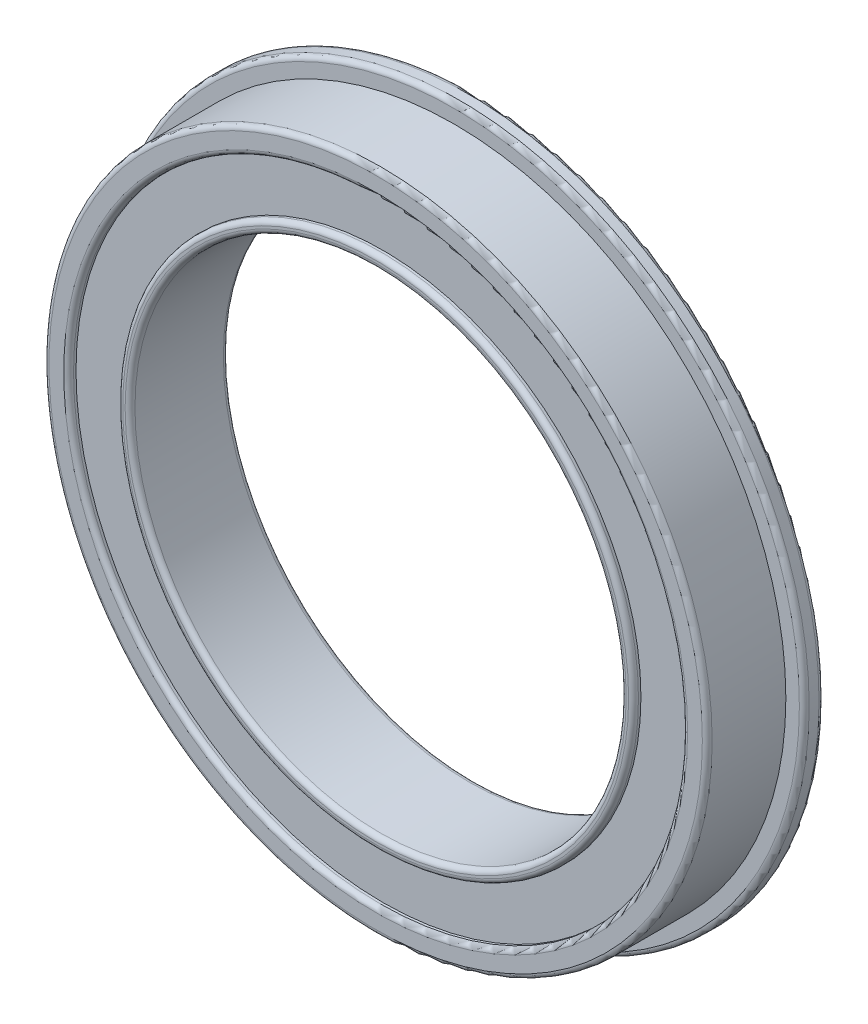
ISO-10303-21;
HEADER;
FILE_DESCRIPTION(('STEP AP214'),'2;1');
FILE_NAME('part.step','',(''),(''),'','','');
FILE_SCHEMA(('AUTOMOTIVE_DESIGN { 1 0 10303 214 1 1 1 1 }'));
ENDSEC;
DATA;
#1=APPLICATION_CONTEXT('core data for automotive mechanical design processes');
#2=APPLICATION_PROTOCOL_DEFINITION('international standard','automotive_design',2000,#1);
#3=PRODUCT_CONTEXT('',#1,'mechanical');
#4=PRODUCT('Part','Part','',(#3));
#5=PRODUCT_RELATED_PRODUCT_CATEGORY('part','',(#4));
#6=PRODUCT_DEFINITION_FORMATION('','',#4);
#7=PRODUCT_DEFINITION_CONTEXT('part definition',#1,'design');
#8=PRODUCT_DEFINITION('design','',#6,#7);
#9=PRODUCT_DEFINITION_SHAPE('','',#8);
#10=(LENGTH_UNIT() NAMED_UNIT(*) SI_UNIT(.MILLI.,.METRE.));
#11=(NAMED_UNIT(*) PLANE_ANGLE_UNIT() SI_UNIT($,.RADIAN.));
#12=(NAMED_UNIT(*) SI_UNIT($,.STERADIAN.) SOLID_ANGLE_UNIT());
#13=UNCERTAINTY_MEASURE_WITH_UNIT(LENGTH_MEASURE(1.E-05),#10,'distance_accuracy_value','');
#14=(GEOMETRIC_REPRESENTATION_CONTEXT(3) GLOBAL_UNCERTAINTY_ASSIGNED_CONTEXT((#13)) GLOBAL_UNIT_ASSIGNED_CONTEXT((#10,
#11,#12)) REPRESENTATION_CONTEXT('',''));
#15=CARTESIAN_POINT('',(0.,0.,0.));
#16=DIRECTION('',(0.,0.,1.));
#17=DIRECTION('',(1.,0.,0.));
#18=AXIS2_PLACEMENT_3D('',#15,#16,#17);
#19=CARTESIAN_POINT('',(0.,0.,0.));
#20=DIRECTION('',(0.,0.,1.));
#21=DIRECTION('',(1.,0.,0.));
#22=AXIS2_PLACEMENT_3D('',#19,#20,#21);
#23=PLANE('',#22);
#24=CARTESIAN_POINT('',(0.,0.,0.));
#25=DIRECTION('',(0.,0.,1.));
#26=DIRECTION('',(1.,0.,0.));
#27=AXIS2_PLACEMENT_3D('',#24,#25,#26);
#28=CIRCLE('',#27,10.3);
#29=CARTESIAN_POINT('',(10.3,0.,0.));
#30=VERTEX_POINT('',#29);
#31=EDGE_CURVE('E81',#30,#30,#28,.F.);
#32=ORIENTED_EDGE('',*,*,#31,.T.);
#33=EDGE_LOOP('',(#32));
#34=FACE_BOUND('',#33,.T.);
#35=CARTESIAN_POINT('',(0.,0.,0.));
#36=DIRECTION('',(0.,0.,1.));
#37=DIRECTION('',(1.,0.,0.));
#38=AXIS2_PLACEMENT_3D('',#35,#36,#37);
#39=CIRCLE('',#38,10.2);
#40=CARTESIAN_POINT('',(10.2,0.,0.));
#41=VERTEX_POINT('',#40);
#42=EDGE_CURVE('E84',#41,#41,#39,.T.);
#43=ORIENTED_EDGE('',*,*,#42,.T.);
#44=EDGE_LOOP('',(#43));
#45=FACE_BOUND('',#44,.T.);
#46=ADVANCED_FACE('F25',(#34,#45),#23,.F.);
#47=CARTESIAN_POINT('',(0.,0.,4.));
#48=DIRECTION('',(0.,0.,1.));
#49=DIRECTION('',(1.,0.,0.));
#50=AXIS2_PLACEMENT_3D('',#47,#48,#49);
#51=PLANE('',#50);
#52=CARTESIAN_POINT('',(0.,0.,4.));
#53=DIRECTION('',(0.,0.,1.));
#54=DIRECTION('',(1.,0.,0.));
#55=AXIS2_PLACEMENT_3D('',#52,#53,#54);
#56=CIRCLE('',#55,10.3);
#57=CARTESIAN_POINT('',(10.3,0.,4.));
#58=VERTEX_POINT('',#57);
#59=EDGE_CURVE('E54',#58,#58,#56,.T.);
#60=ORIENTED_EDGE('',*,*,#59,.T.);
#61=EDGE_LOOP('',(#60));
#62=FACE_BOUND('',#61,.T.);
#63=CARTESIAN_POINT('',(0.,0.,4.));
#64=DIRECTION('',(0.,0.,1.));
#65=DIRECTION('',(1.,0.,0.));
#66=AXIS2_PLACEMENT_3D('',#63,#64,#65);
#67=CIRCLE('',#66,10.2);
#68=CARTESIAN_POINT('',(10.2,0.,4.));
#69=VERTEX_POINT('',#68);
#70=EDGE_CURVE('E57',#69,#69,#67,.F.);
#71=ORIENTED_EDGE('',*,*,#70,.T.);
#72=EDGE_LOOP('',(#71));
#73=FACE_BOUND('',#72,.T.);
#74=ADVANCED_FACE('F124',(#62,#73),#51,.T.);
#75=CARTESIAN_POINT('',(0.,0.,0.8));
#76=DIRECTION('',(0.,0.,1.));
#77=DIRECTION('',(1.,0.,0.));
#78=AXIS2_PLACEMENT_3D('',#75,#76,#77);
#79=PLANE('',#78);
#80=CARTESIAN_POINT('',(0.,0.,0.8));
#81=DIRECTION('',(0.,0.,1.));
#82=DIRECTION('',(1.,0.,0.));
#83=AXIS2_PLACEMENT_3D('',#80,#81,#82);
#84=CIRCLE('',#83,14.05);
#85=CARTESIAN_POINT('',(14.05,0.,0.8));
#86=VERTEX_POINT('',#85);
#87=EDGE_CURVE('E32',#86,#86,#84,.T.);
#88=ORIENTED_EDGE('',*,*,#87,.T.);
#89=EDGE_LOOP('',(#88));
#90=FACE_BOUND('',#89,.T.);
#91=CARTESIAN_POINT('',(0.,0.,0.8));
#92=DIRECTION('',(0.,0.,1.));
#93=DIRECTION('',(1.,0.,0.));
#94=AXIS2_PLACEMENT_3D('',#91,#92,#93);
#95=CIRCLE('',#94,13.5);
#96=CARTESIAN_POINT('',(13.5,0.,0.8));
#97=VERTEX_POINT('',#96);
#98=EDGE_CURVE('E87',#97,#97,#95,.T.);
#99=ORIENTED_EDGE('',*,*,#98,.F.);
#100=EDGE_LOOP('',(#99));
#101=FACE_BOUND('',#100,.T.);
#102=ADVANCED_FACE('F131',(#90,#101),#79,.T.);
#103=CARTESIAN_POINT('',(0.,0.,0.8));
#104=DIRECTION('',(0.,0.,-1.));
#105=DIRECTION('',(-1.,0.,0.));
#106=AXIS2_PLACEMENT_3D('',#103,#104,#105);
#107=CYLINDRICAL_SURFACE('',#106,14.25);
#108=CARTESIAN_POINT('',(0.,0.,0.2));
#109=DIRECTION('',(0.,0.,1.));
#110=DIRECTION('',(1.,0.,0.));
#111=AXIS2_PLACEMENT_3D('',#108,#109,#110);
#112=CIRCLE('',#111,14.25);
#113=CARTESIAN_POINT('',(14.25,0.,0.2));
#114=VERTEX_POINT('',#113);
#115=EDGE_CURVE('E36',#114,#114,#112,.T.);
#116=ORIENTED_EDGE('',*,*,#115,.T.);
#117=EDGE_LOOP('',(#116));
#118=FACE_BOUND('',#117,.T.);
#119=CARTESIAN_POINT('',(0.,0.,0.6));
#120=DIRECTION('',(0.,0.,1.));
#121=DIRECTION('',(1.,0.,0.));
#122=AXIS2_PLACEMENT_3D('',#119,#120,#121);
#123=CIRCLE('',#122,14.25);
#124=CARTESIAN_POINT('',(14.25,0.,0.6));
#125=VERTEX_POINT('',#124);
#126=EDGE_CURVE('E40',#125,#125,#123,.F.);
#127=ORIENTED_EDGE('',*,*,#126,.T.);
#128=EDGE_LOOP('',(#127));
#129=FACE_BOUND('',#128,.T.);
#130=ADVANCED_FACE('F27',(#118,#129),#107,.T.);
#131=CARTESIAN_POINT('',(0.,0.,0.));
#132=DIRECTION('',(0.,0.,1.));
#133=DIRECTION('',(1.,0.,0.));
#134=AXIS2_PLACEMENT_3D('',#131,#132,#133);
#135=CIRCLE('',#134,12.7);
#136=CARTESIAN_POINT('',(12.7,0.,0.));
#137=VERTEX_POINT('',#136);
#138=EDGE_CURVE('E69',#137,#137,#135,.T.);
#139=ORIENTED_EDGE('',*,*,#138,.T.);
#140=EDGE_LOOP('',(#139));
#141=FACE_BOUND('',#140,.T.);
#142=CARTESIAN_POINT('',(0.,0.,0.));
#143=DIRECTION('',(0.,0.,1.));
#144=DIRECTION('',(1.,0.,0.));
#145=AXIS2_PLACEMENT_3D('',#142,#143,#144);
#146=CIRCLE('',#145,14.05);
#147=CARTESIAN_POINT('',(14.05,0.,0.));
#148=VERTEX_POINT('',#147);
#149=EDGE_CURVE('E72',#148,#148,#146,.F.);
#150=ORIENTED_EDGE('',*,*,#149,.T.);
#151=EDGE_LOOP('',(#150));
#152=FACE_BOUND('',#151,.T.);
#153=ADVANCED_FACE('F127',(#141,#152),#23,.F.);
#154=CARTESIAN_POINT('',(0.,0.,4.));
#155=DIRECTION('',(0.,0.,-1.));
#156=DIRECTION('',(-1.,0.,0.));
#157=AXIS2_PLACEMENT_3D('',#154,#155,#156);
#158=CYLINDRICAL_SURFACE('',#157,13.5);
#159=CARTESIAN_POINT('',(0.,0.,3.8));
#160=DIRECTION('',(0.,0.,1.));
#161=DIRECTION('',(1.,0.,0.));
#162=AXIS2_PLACEMENT_3D('',#159,#160,#161);
#163=CIRCLE('',#162,13.5);
#164=CARTESIAN_POINT('',(13.5,0.,3.8));
#165=VERTEX_POINT('',#164);
#166=EDGE_CURVE('E10',#165,#165,#163,.F.);
#167=ORIENTED_EDGE('',*,*,#166,.T.);
#168=EDGE_LOOP('',(#167));
#169=FACE_BOUND('',#168,.T.);
#170=ORIENTED_EDGE('',*,*,#98,.T.);
#171=EDGE_LOOP('',(#170));
#172=FACE_BOUND('',#171,.T.);
#173=ADVANCED_FACE('F138',(#169,#172),#158,.T.);
#174=CARTESIAN_POINT('',(0.,0.,4.));
#175=DIRECTION('',(0.,0.,1.));
#176=DIRECTION('',(1.,0.,0.));
#177=AXIS2_PLACEMENT_3D('',#174,#175,#176);
#178=CIRCLE('',#177,12.7);
#179=CARTESIAN_POINT('',(12.7,0.,4.));
#180=VERTEX_POINT('',#179);
#181=EDGE_CURVE('E60',#180,#180,#178,.F.);
#182=ORIENTED_EDGE('',*,*,#181,.T.);
#183=EDGE_LOOP('',(#182));
#184=FACE_BOUND('',#183,.T.);
#185=CARTESIAN_POINT('',(0.,0.,4.));
#186=DIRECTION('',(0.,0.,1.));
#187=DIRECTION('',(1.,0.,0.));
#188=AXIS2_PLACEMENT_3D('',#185,#186,#187);
#189=CIRCLE('',#188,13.3);
#190=CARTESIAN_POINT('',(13.3,0.,4.));
#191=VERTEX_POINT('',#190);
#192=EDGE_CURVE('E63',#191,#191,#189,.T.);
#193=ORIENTED_EDGE('',*,*,#192,.T.);
#194=EDGE_LOOP('',(#193));
#195=FACE_BOUND('',#194,.T.);
#196=ADVANCED_FACE('F134',(#184,#195),#51,.T.);
#197=CARTESIAN_POINT('',(0.,0.,0.));
#198=DIRECTION('',(0.,0.,1.));
#199=DIRECTION('',(1.,0.,0.));
#200=AXIS2_PLACEMENT_3D('',#197,#198,#199);
#201=CYLINDRICAL_SURFACE('',#200,10.);
#202=CARTESIAN_POINT('',(0.,0.,0.2));
#203=DIRECTION('',(0.,0.,1.));
#204=DIRECTION('',(1.,0.,0.));
#205=AXIS2_PLACEMENT_3D('',#202,#203,#204);
#206=CIRCLE('',#205,10.);
#207=CARTESIAN_POINT('',(10.,0.,0.2));
#208=VERTEX_POINT('',#207);
#209=EDGE_CURVE('E45',#208,#208,#206,.F.);
#210=ORIENTED_EDGE('',*,*,#209,.T.);
#211=EDGE_LOOP('',(#210));
#212=FACE_BOUND('',#211,.T.);
#213=CARTESIAN_POINT('',(0.,0.,3.8));
#214=DIRECTION('',(0.,0.,1.));
#215=DIRECTION('',(1.,0.,0.));
#216=AXIS2_PLACEMENT_3D('',#213,#214,#215);
#217=CIRCLE('',#216,10.);
#218=CARTESIAN_POINT('',(10.,0.,3.8));
#219=VERTEX_POINT('',#218);
#220=EDGE_CURVE('E48',#219,#219,#217,.T.);
#221=ORIENTED_EDGE('',*,*,#220,.T.);
#222=EDGE_LOOP('',(#221));
#223=FACE_BOUND('',#222,.T.);
#224=ADVANCED_FACE('F259',(#212,#223),#201,.F.);
#225=CARTESIAN_POINT('',(0.,0.,3.7));
#226=DIRECTION('',(0.,0.,1.));
#227=DIRECTION('',(1.,0.,0.));
#228=AXIS2_PLACEMENT_3D('',#225,#226,#227);
#229=CYLINDRICAL_SURFACE('',#228,12.5);
#230=CARTESIAN_POINT('',(0.,0.,3.8));
#231=DIRECTION('',(0.,0.,1.));
#232=DIRECTION('',(1.,0.,0.));
#233=AXIS2_PLACEMENT_3D('',#230,#231,#232);
#234=CIRCLE('',#233,12.5);
#235=CARTESIAN_POINT('',(12.5,0.,3.8));
#236=VERTEX_POINT('',#235);
#237=EDGE_CURVE('E66',#236,#236,#234,.T.);
#238=ORIENTED_EDGE('',*,*,#237,.T.);
#239=EDGE_LOOP('',(#238));
#240=FACE_BOUND('',#239,.T.);
#241=CARTESIAN_POINT('',(0.,0.,3.7));
#242=DIRECTION('',(0.,0.,1.));
#243=DIRECTION('',(1.,0.,0.));
#244=AXIS2_PLACEMENT_3D('',#241,#242,#243);
#245=CIRCLE('',#244,12.5);
#246=CARTESIAN_POINT('',(12.5,0.,3.7));
#247=VERTEX_POINT('',#246);
#248=EDGE_CURVE('E90',#247,#247,#245,.T.);
#249=ORIENTED_EDGE('',*,*,#248,.F.);
#250=EDGE_LOOP('',(#249));
#251=FACE_BOUND('',#250,.T.);
#252=ADVANCED_FACE('F252',(#240,#251),#229,.F.);
#253=CARTESIAN_POINT('',(0.,0.,3.7));
#254=DIRECTION('',(0.,0.,1.));
#255=DIRECTION('',(1.,0.,0.));
#256=AXIS2_PLACEMENT_3D('',#253,#254,#255);
#257=PLANE('',#256);
#258=CARTESIAN_POINT('',(0.,0.,3.7));
#259=DIRECTION('',(0.,0.,1.));
#260=DIRECTION('',(1.,0.,0.));
#261=AXIS2_PLACEMENT_3D('',#258,#259,#260);
#262=CIRCLE('',#261,10.5);
#263=CARTESIAN_POINT('',(10.5,0.,3.7));
#264=VERTEX_POINT('',#263);
#265=EDGE_CURVE('E93',#264,#264,#262,.T.);
#266=ORIENTED_EDGE('',*,*,#265,.F.);
#267=EDGE_LOOP('',(#266));
#268=FACE_BOUND('',#267,.T.);
#269=ORIENTED_EDGE('',*,*,#248,.T.);
#270=EDGE_LOOP('',(#269));
#271=FACE_BOUND('',#270,.T.);
#272=ADVANCED_FACE('F120',(#268,#271),#257,.T.);
#273=CARTESIAN_POINT('',(0.,0.,3.7));
#274=DIRECTION('',(0.,0.,1.));
#275=DIRECTION('',(1.,0.,0.));
#276=AXIS2_PLACEMENT_3D('',#273,#274,#275);
#277=CYLINDRICAL_SURFACE('',#276,10.5);
#278=CARTESIAN_POINT('',(0.,0.,3.8));
#279=DIRECTION('',(0.,0.,1.));
#280=DIRECTION('',(1.,0.,0.));
#281=AXIS2_PLACEMENT_3D('',#278,#279,#280);
#282=CIRCLE('',#281,10.5);
#283=CARTESIAN_POINT('',(10.5,0.,3.8));
#284=VERTEX_POINT('',#283);
#285=EDGE_CURVE('E51',#284,#284,#282,.F.);
#286=ORIENTED_EDGE('',*,*,#285,.T.);
#287=EDGE_LOOP('',(#286));
#288=FACE_BOUND('',#287,.T.);
#289=ORIENTED_EDGE('',*,*,#265,.T.);
#290=EDGE_LOOP('',(#289));
#291=FACE_BOUND('',#290,.T.);
#292=ADVANCED_FACE('F113',(#288,#291),#277,.T.);
#293=CARTESIAN_POINT('',(0.,0.,0.3));
#294=DIRECTION('',(0.,0.,-1.));
#295=DIRECTION('',(-1.,0.,0.));
#296=AXIS2_PLACEMENT_3D('',#293,#294,#295);
#297=CYLINDRICAL_SURFACE('',#296,12.5);
#298=CARTESIAN_POINT('',(0.,0.,0.2));
#299=DIRECTION('',(0.,0.,1.));
#300=DIRECTION('',(1.,0.,0.));
#301=AXIS2_PLACEMENT_3D('',#298,#299,#300);
#302=CIRCLE('',#301,12.5);
#303=CARTESIAN_POINT('',(12.5,0.,0.2));
#304=VERTEX_POINT('',#303);
#305=EDGE_CURVE('E75',#304,#304,#302,.F.);
#306=ORIENTED_EDGE('',*,*,#305,.T.);
#307=EDGE_LOOP('',(#306));
#308=FACE_BOUND('',#307,.T.);
#309=CARTESIAN_POINT('',(0.,0.,0.3));
#310=DIRECTION('',(0.,0.,-1.));
#311=DIRECTION('',(-1.,0.,0.));
#312=AXIS2_PLACEMENT_3D('',#309,#310,#311);
#313=CIRCLE('',#312,12.5);
#314=CARTESIAN_POINT('',(-12.5,0.,0.3));
#315=VERTEX_POINT('',#314);
#316=EDGE_CURVE('E96',#315,#315,#313,.T.);
#317=ORIENTED_EDGE('',*,*,#316,.F.);
#318=EDGE_LOOP('',(#317));
#319=FACE_BOUND('',#318,.T.);
#320=ADVANCED_FACE('F108',(#308,#319),#297,.F.);
#321=CARTESIAN_POINT('',(0.,0.,0.3));
#322=DIRECTION('',(0.,0.,-1.));
#323=DIRECTION('',(-1.,0.,0.));
#324=AXIS2_PLACEMENT_3D('',#321,#322,#323);
#325=PLANE('',#324);
#326=CARTESIAN_POINT('',(0.,0.,0.3));
#327=DIRECTION('',(0.,0.,-1.));
#328=DIRECTION('',(-1.,0.,0.));
#329=AXIS2_PLACEMENT_3D('',#326,#327,#328);
#330=CIRCLE('',#329,10.5);
#331=CARTESIAN_POINT('',(-10.5,0.,0.3));
#332=VERTEX_POINT('',#331);
#333=EDGE_CURVE('E99',#332,#332,#330,.T.);
#334=ORIENTED_EDGE('',*,*,#333,.F.);
#335=EDGE_LOOP('',(#334));
#336=FACE_BOUND('',#335,.T.);
#337=ORIENTED_EDGE('',*,*,#316,.T.);
#338=EDGE_LOOP('',(#337));
#339=FACE_BOUND('',#338,.T.);
#340=ADVANCED_FACE('F105',(#336,#339),#325,.T.);
#341=CARTESIAN_POINT('',(0.,0.,0.3));
#342=DIRECTION('',(0.,0.,-1.));
#343=DIRECTION('',(-1.,0.,0.));
#344=AXIS2_PLACEMENT_3D('',#341,#342,#343);
#345=CYLINDRICAL_SURFACE('',#344,10.5);
#346=CARTESIAN_POINT('',(0.,0.,0.2));
#347=DIRECTION('',(0.,0.,1.));
#348=DIRECTION('',(1.,0.,0.));
#349=AXIS2_PLACEMENT_3D('',#346,#347,#348);
#350=CIRCLE('',#349,10.5);
#351=CARTESIAN_POINT('',(10.5,0.,0.2));
#352=VERTEX_POINT('',#351);
#353=EDGE_CURVE('E78',#352,#352,#350,.T.);
#354=ORIENTED_EDGE('',*,*,#353,.T.);
#355=EDGE_LOOP('',(#354));
#356=FACE_BOUND('',#355,.T.);
#357=ORIENTED_EDGE('',*,*,#333,.T.);
#358=EDGE_LOOP('',(#357));
#359=FACE_BOUND('',#358,.T.);
#360=ADVANCED_FACE('F103',(#356,#359),#345,.T.);
#361=CARTESIAN_POINT('',(0.,0.,0.2));
#362=DIRECTION('',(0.,0.,1.));
#363=DIRECTION('',(1.,0.,0.));
#364=AXIS2_PLACEMENT_3D('',#361,#362,#363);
#365=TOROIDAL_SURFACE('',#364,10.3,0.2);
#366=ORIENTED_EDGE('',*,*,#353,.F.);
#367=EDGE_LOOP('',(#366));
#368=FACE_BOUND('',#367,.T.);
#369=ORIENTED_EDGE('',*,*,#31,.F.);
#370=EDGE_LOOP('',(#369));
#371=FACE_BOUND('',#370,.T.);
#372=ADVANCED_FACE('F187',(#368,#371),#365,.T.);
#373=CARTESIAN_POINT('',(0.,0.,0.2));
#374=DIRECTION('',(0.,0.,1.));
#375=DIRECTION('',(1.,0.,0.));
#376=AXIS2_PLACEMENT_3D('',#373,#374,#375);
#377=TOROIDAL_SURFACE('',#376,12.7,0.2);
#378=ORIENTED_EDGE('',*,*,#138,.F.);
#379=EDGE_LOOP('',(#378));
#380=FACE_BOUND('',#379,.T.);
#381=ORIENTED_EDGE('',*,*,#305,.F.);
#382=EDGE_LOOP('',(#381));
#383=FACE_BOUND('',#382,.T.);
#384=ADVANCED_FACE('F183',(#380,#383),#377,.T.);
#385=CARTESIAN_POINT('',(0.,0.,3.8));
#386=DIRECTION('',(0.,0.,1.));
#387=DIRECTION('',(1.,0.,0.));
#388=AXIS2_PLACEMENT_3D('',#385,#386,#387);
#389=TOROIDAL_SURFACE('',#388,12.7,0.2);
#390=ORIENTED_EDGE('',*,*,#181,.F.);
#391=EDGE_LOOP('',(#390));
#392=FACE_BOUND('',#391,.T.);
#393=ORIENTED_EDGE('',*,*,#237,.F.);
#394=EDGE_LOOP('',(#393));
#395=FACE_BOUND('',#394,.T.);
#396=ADVANCED_FACE('F179',(#392,#395),#389,.T.);
#397=CARTESIAN_POINT('',(0.,0.,3.8));
#398=DIRECTION('',(0.,0.,1.));
#399=DIRECTION('',(1.,0.,0.));
#400=AXIS2_PLACEMENT_3D('',#397,#398,#399);
#401=TOROIDAL_SURFACE('',#400,10.3,0.2);
#402=ORIENTED_EDGE('',*,*,#285,.F.);
#403=EDGE_LOOP('',(#402));
#404=FACE_BOUND('',#403,.T.);
#405=ORIENTED_EDGE('',*,*,#59,.F.);
#406=EDGE_LOOP('',(#405));
#407=FACE_BOUND('',#406,.T.);
#408=ADVANCED_FACE('F175',(#404,#407),#401,.T.);
#409=CARTESIAN_POINT('',(0.,0.,0.2));
#410=DIRECTION('',(0.,0.,1.));
#411=DIRECTION('',(1.,0.,0.));
#412=AXIS2_PLACEMENT_3D('',#409,#410,#411);
#413=TOROIDAL_SURFACE('',#412,10.2,0.2);
#414=ORIENTED_EDGE('',*,*,#209,.F.);
#415=EDGE_LOOP('',(#414));
#416=FACE_BOUND('',#415,.T.);
#417=ORIENTED_EDGE('',*,*,#42,.F.);
#418=EDGE_LOOP('',(#417));
#419=FACE_BOUND('',#418,.T.);
#420=ADVANCED_FACE('F171',(#416,#419),#413,.T.);
#421=CARTESIAN_POINT('',(0.,0.,3.8));
#422=DIRECTION('',(0.,0.,1.));
#423=DIRECTION('',(1.,0.,0.));
#424=AXIS2_PLACEMENT_3D('',#421,#422,#423);
#425=TOROIDAL_SURFACE('',#424,10.2,0.2);
#426=ORIENTED_EDGE('',*,*,#70,.F.);
#427=EDGE_LOOP('',(#426));
#428=FACE_BOUND('',#427,.T.);
#429=ORIENTED_EDGE('',*,*,#220,.F.);
#430=EDGE_LOOP('',(#429));
#431=FACE_BOUND('',#430,.T.);
#432=ADVANCED_FACE('F153',(#428,#431),#425,.T.);
#433=CARTESIAN_POINT('',(0.,0.,0.2));
#434=DIRECTION('',(0.,0.,1.));
#435=DIRECTION('',(1.,0.,0.));
#436=AXIS2_PLACEMENT_3D('',#433,#434,#435);
#437=TOROIDAL_SURFACE('',#436,14.05,0.2);
#438=ORIENTED_EDGE('',*,*,#149,.F.);
#439=EDGE_LOOP('',(#438));
#440=FACE_BOUND('',#439,.T.);
#441=ORIENTED_EDGE('',*,*,#115,.F.);
#442=EDGE_LOOP('',(#441));
#443=FACE_BOUND('',#442,.T.);
#444=ADVANCED_FACE('F149',(#440,#443),#437,.T.);
#445=CARTESIAN_POINT('',(0.,0.,0.6));
#446=DIRECTION('',(0.,0.,1.));
#447=DIRECTION('',(1.,0.,0.));
#448=AXIS2_PLACEMENT_3D('',#445,#446,#447);
#449=TOROIDAL_SURFACE('',#448,14.05,0.2);
#450=ORIENTED_EDGE('',*,*,#126,.F.);
#451=EDGE_LOOP('',(#450));
#452=FACE_BOUND('',#451,.T.);
#453=ORIENTED_EDGE('',*,*,#87,.F.);
#454=EDGE_LOOP('',(#453));
#455=FACE_BOUND('',#454,.T.);
#456=ADVANCED_FACE('F152',(#452,#455),#449,.T.);
#457=CARTESIAN_POINT('',(0.,0.,3.8));
#458=DIRECTION('',(0.,0.,1.));
#459=DIRECTION('',(1.,0.,0.));
#460=AXIS2_PLACEMENT_3D('',#457,#458,#459);
#461=TOROIDAL_SURFACE('',#460,13.3,0.2);
#462=ORIENTED_EDGE('',*,*,#166,.F.);
#463=EDGE_LOOP('',(#462));
#464=FACE_BOUND('',#463,.T.);
#465=ORIENTED_EDGE('',*,*,#192,.F.);
#466=EDGE_LOOP('',(#465));
#467=FACE_BOUND('',#466,.T.);
#468=ADVANCED_FACE('F161',(#464,#467),#461,.T.);
#469=CLOSED_SHELL('',(#46,#74,#102,#130,#153,#173,#196,#224,#252,#272,#292,#320,#340,#360,#372,
#384,#396,#408,#420,#432,#444,#456,#468));
#470=MANIFOLD_SOLID_BREP('B2',#469);
#471=ADVANCED_BREP_SHAPE_REPRESENTATION('',(#18,#470),#14);
#472=SHAPE_DEFINITION_REPRESENTATION(#9,#471);
ENDSEC;
END-ISO-10303-21;
